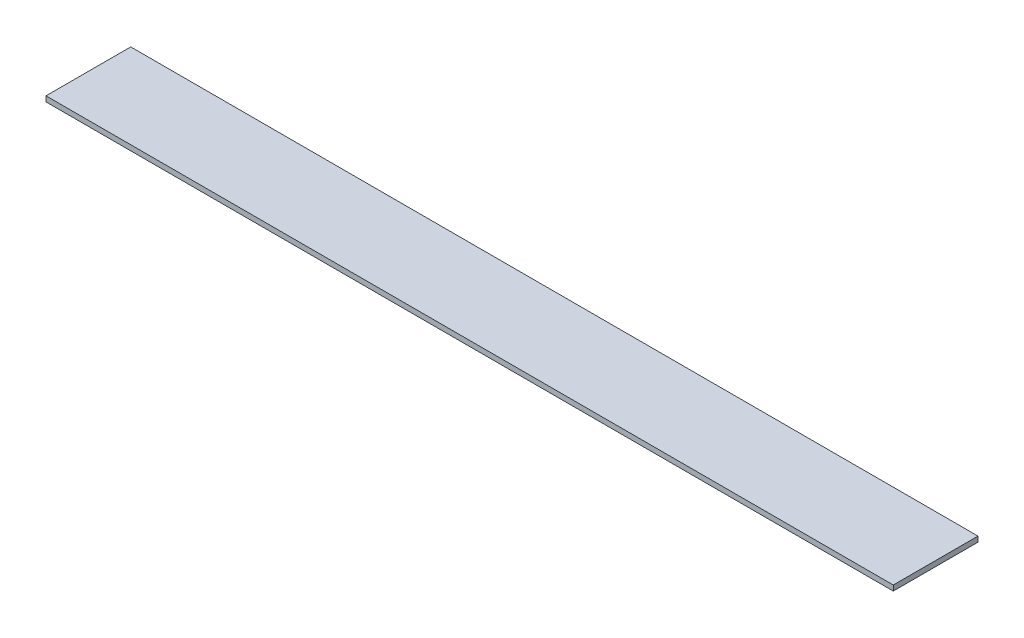
ISO-10303-21;
HEADER;
FILE_DESCRIPTION(('STEP AP214'),'2;1');
FILE_NAME('part.step','',(''),(''),'','','');
FILE_SCHEMA(('AUTOMOTIVE_DESIGN { 1 0 10303 214 1 1 1 1 }'));
ENDSEC;
DATA;
#1=APPLICATION_CONTEXT('core data for automotive mechanical design processes');
#2=APPLICATION_PROTOCOL_DEFINITION('international standard','automotive_design',2000,#1);
#3=PRODUCT_CONTEXT('',#1,'mechanical');
#4=PRODUCT('Part','Part','',(#3));
#5=PRODUCT_RELATED_PRODUCT_CATEGORY('part','',(#4));
#6=PRODUCT_DEFINITION_FORMATION('','',#4);
#7=PRODUCT_DEFINITION_CONTEXT('part definition',#1,'design');
#8=PRODUCT_DEFINITION('design','',#6,#7);
#9=PRODUCT_DEFINITION_SHAPE('','',#8);
#10=(LENGTH_UNIT() NAMED_UNIT(*) SI_UNIT(.MILLI.,.METRE.));
#11=(NAMED_UNIT(*) PLANE_ANGLE_UNIT() SI_UNIT($,.RADIAN.));
#12=(NAMED_UNIT(*) SI_UNIT($,.STERADIAN.) SOLID_ANGLE_UNIT());
#13=UNCERTAINTY_MEASURE_WITH_UNIT(LENGTH_MEASURE(1.E-05),#10,'distance_accuracy_value','');
#14=(GEOMETRIC_REPRESENTATION_CONTEXT(3) GLOBAL_UNCERTAINTY_ASSIGNED_CONTEXT((#13)) GLOBAL_UNIT_ASSIGNED_CONTEXT((#10,
#11,#12)) REPRESENTATION_CONTEXT('',''));
#15=CARTESIAN_POINT('',(0.,0.,0.));
#16=DIRECTION('',(0.,0.,1.));
#17=DIRECTION('',(1.,0.,0.));
#18=AXIS2_PLACEMENT_3D('',#15,#16,#17);
#19=CARTESIAN_POINT('',(0.,1.5875,0.));
#20=DIRECTION('',(1.,0.,0.));
#21=DIRECTION('',(0.,0.,-1.));
#22=AXIS2_PLACEMENT_3D('',#19,#20,#21);
#23=PLANE('',#22);
#24=DIRECTION('',(0.,0.,1.));
#25=VECTOR('',#24,1.);
#26=CARTESIAN_POINT('',(0.,0.,0.));
#27=LINE('',#26,#25);
#28=CARTESIAN_POINT('',(0.,0.,-25.4));
#29=VERTEX_POINT('',#28);
#30=CARTESIAN_POINT('',(0.,0.,0.));
#31=VERTEX_POINT('',#30);
#32=EDGE_CURVE('E96',#29,#31,#27,.T.);
#33=ORIENTED_EDGE('',*,*,#32,.T.);
#34=DIRECTION('',(0.,-1.,0.));
#35=VECTOR('',#34,1.);
#36=CARTESIAN_POINT('',(0.,1.5875,0.));
#37=LINE('',#36,#35);
#38=CARTESIAN_POINT('',(0.,1.5875,0.));
#39=VERTEX_POINT('',#38);
#40=EDGE_CURVE('E11',#39,#31,#37,.T.);
#41=ORIENTED_EDGE('',*,*,#40,.F.);
#42=DIRECTION('',(0.,0.,1.));
#43=VECTOR('',#42,1.);
#44=CARTESIAN_POINT('',(0.,1.5875,0.));
#45=LINE('',#44,#43);
#46=CARTESIAN_POINT('',(0.,1.5875,-25.4));
#47=VERTEX_POINT('',#46);
#48=EDGE_CURVE('E84',#47,#39,#45,.T.);
#49=ORIENTED_EDGE('',*,*,#48,.F.);
#50=DIRECTION('',(0.,-1.,0.));
#51=VECTOR('',#50,1.);
#52=CARTESIAN_POINT('',(0.,1.5875,-25.4));
#53=LINE('',#52,#51);
#54=EDGE_CURVE('E92',#47,#29,#53,.T.);
#55=ORIENTED_EDGE('',*,*,#54,.T.);
#56=EDGE_LOOP('',(#33,#41,#49,#55));
#57=FACE_BOUND('',#56,.T.);
#58=ADVANCED_FACE('F33',(#57),#23,.F.);
#59=CARTESIAN_POINT('',(0.,1.5875,0.));
#60=DIRECTION('',(0.,0.,-1.));
#61=DIRECTION('',(-1.,0.,0.));
#62=AXIS2_PLACEMENT_3D('',#59,#60,#61);
#63=PLANE('',#62);
#64=DIRECTION('',(1.,0.,0.));
#65=VECTOR('',#64,1.);
#66=CARTESIAN_POINT('',(0.,0.,0.));
#67=LINE('',#66,#65);
#68=CARTESIAN_POINT('',(254.,0.,0.));
#69=VERTEX_POINT('',#68);
#70=EDGE_CURVE('E88',#31,#69,#67,.T.);
#71=ORIENTED_EDGE('',*,*,#70,.T.);
#72=DIRECTION('',(0.,-1.,0.));
#73=VECTOR('',#72,1.);
#74=CARTESIAN_POINT('',(254.,1.5875,0.));
#75=LINE('',#74,#73);
#76=CARTESIAN_POINT('',(254.,1.5875,0.));
#77=VERTEX_POINT('',#76);
#78=EDGE_CURVE('E41',#77,#69,#75,.T.);
#79=ORIENTED_EDGE('',*,*,#78,.F.);
#80=DIRECTION('',(1.,0.,0.));
#81=VECTOR('',#80,1.);
#82=CARTESIAN_POINT('',(0.,1.5875,0.));
#83=LINE('',#82,#81);
#84=EDGE_CURVE('E79',#39,#77,#83,.T.);
#85=ORIENTED_EDGE('',*,*,#84,.F.);
#86=ORIENTED_EDGE('',*,*,#40,.T.);
#87=EDGE_LOOP('',(#71,#79,#85,#86));
#88=FACE_BOUND('',#87,.T.);
#89=ADVANCED_FACE('F87',(#88),#63,.F.);
#90=CARTESIAN_POINT('',(254.,1.5875,0.));
#91=DIRECTION('',(-1.,0.,0.));
#92=DIRECTION('',(0.,0.,1.));
#93=AXIS2_PLACEMENT_3D('',#90,#91,#92);
#94=PLANE('',#93);
#95=DIRECTION('',(0.,0.,-1.));
#96=VECTOR('',#95,1.);
#97=CARTESIAN_POINT('',(254.,0.,0.));
#98=LINE('',#97,#96);
#99=CARTESIAN_POINT('',(254.,0.,-25.4));
#100=VERTEX_POINT('',#99);
#101=EDGE_CURVE('E66',#69,#100,#98,.T.);
#102=ORIENTED_EDGE('',*,*,#101,.T.);
#103=DIRECTION('',(0.,-1.,0.));
#104=VECTOR('',#103,1.);
#105=CARTESIAN_POINT('',(254.,1.5875,-25.4));
#106=LINE('',#105,#104);
#107=CARTESIAN_POINT('',(254.,1.5875,-25.4));
#108=VERTEX_POINT('',#107);
#109=EDGE_CURVE('E89',#108,#100,#106,.T.);
#110=ORIENTED_EDGE('',*,*,#109,.F.);
#111=DIRECTION('',(0.,0.,-1.));
#112=VECTOR('',#111,1.);
#113=CARTESIAN_POINT('',(254.,1.5875,0.));
#114=LINE('',#113,#112);
#115=EDGE_CURVE('E82',#77,#108,#114,.T.);
#116=ORIENTED_EDGE('',*,*,#115,.F.);
#117=ORIENTED_EDGE('',*,*,#78,.T.);
#118=EDGE_LOOP('',(#102,#110,#116,#117));
#119=FACE_BOUND('',#118,.T.);
#120=ADVANCED_FACE('F90',(#119),#94,.F.);
#121=CARTESIAN_POINT('',(0.,1.5875,-25.4));
#122=DIRECTION('',(0.,0.,1.));
#123=DIRECTION('',(1.,0.,0.));
#124=AXIS2_PLACEMENT_3D('',#121,#122,#123);
#125=PLANE('',#124);
#126=DIRECTION('',(-1.,0.,0.));
#127=VECTOR('',#126,1.);
#128=CARTESIAN_POINT('',(0.,0.,-25.4));
#129=LINE('',#128,#127);
#130=EDGE_CURVE('E72',#100,#29,#129,.T.);
#131=ORIENTED_EDGE('',*,*,#130,.T.);
#132=ORIENTED_EDGE('',*,*,#54,.F.);
#133=DIRECTION('',(-1.,0.,0.));
#134=VECTOR('',#133,1.);
#135=CARTESIAN_POINT('',(0.,1.5875,-25.4));
#136=LINE('',#135,#134);
#137=EDGE_CURVE('E49',#108,#47,#136,.T.);
#138=ORIENTED_EDGE('',*,*,#137,.F.);
#139=ORIENTED_EDGE('',*,*,#109,.T.);
#140=EDGE_LOOP('',(#131,#132,#138,#139));
#141=FACE_BOUND('',#140,.T.);
#142=ADVANCED_FACE('F103',(#141),#125,.F.);
#143=CARTESIAN_POINT('',(0.,1.5875,0.));
#144=DIRECTION('',(0.,-1.,0.));
#145=DIRECTION('',(0.,0.,-1.));
#146=AXIS2_PLACEMENT_3D('',#143,#144,#145);
#147=PLANE('',#146);
#148=ORIENTED_EDGE('',*,*,#48,.T.);
#149=ORIENTED_EDGE('',*,*,#84,.T.);
#150=ORIENTED_EDGE('',*,*,#115,.T.);
#151=ORIENTED_EDGE('',*,*,#137,.T.);
#152=EDGE_LOOP('',(#148,#149,#150,#151));
#153=FACE_BOUND('',#152,.T.);
#154=ADVANCED_FACE('F80',(#153),#147,.F.);
#155=CARTESIAN_POINT('',(0.,0.,0.));
#156=DIRECTION('',(0.,-1.,0.));
#157=DIRECTION('',(0.,0.,-1.));
#158=AXIS2_PLACEMENT_3D('',#155,#156,#157);
#159=PLANE('',#158);
#160=ORIENTED_EDGE('',*,*,#32,.F.);
#161=ORIENTED_EDGE('',*,*,#130,.F.);
#162=ORIENTED_EDGE('',*,*,#101,.F.);
#163=ORIENTED_EDGE('',*,*,#70,.F.);
#164=EDGE_LOOP('',(#160,#161,#162,#163));
#165=FACE_BOUND('',#164,.T.);
#166=ADVANCED_FACE('F106',(#165),#159,.T.);
#167=CLOSED_SHELL('',(#58,#89,#120,#142,#154,#166));
#168=MANIFOLD_SOLID_BREP('B2',#167);
#169=ADVANCED_BREP_SHAPE_REPRESENTATION('',(#18,#168),#14);
#170=SHAPE_DEFINITION_REPRESENTATION(#9,#169);
ENDSEC;
END-ISO-10303-21;
